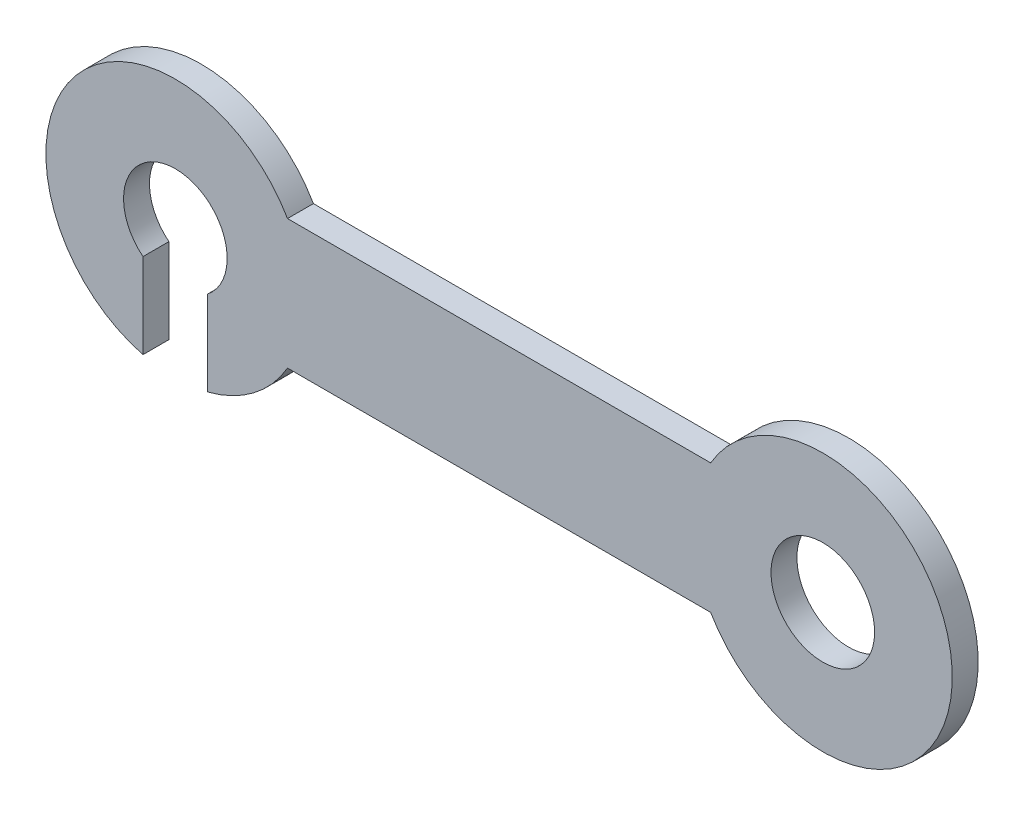
ISO-10303-21;
HEADER;
FILE_DESCRIPTION(('STEP AP214'),'2;1');
FILE_NAME('part.step','',(''),(''),'','','');
FILE_SCHEMA(('AUTOMOTIVE_DESIGN { 1 0 10303 214 1 1 1 1 }'));
ENDSEC;
DATA;
#1=APPLICATION_CONTEXT('core data for automotive mechanical design processes');
#2=APPLICATION_PROTOCOL_DEFINITION('international standard','automotive_design',2000,#1);
#3=PRODUCT_CONTEXT('',#1,'mechanical');
#4=PRODUCT('Part','Part','',(#3));
#5=PRODUCT_RELATED_PRODUCT_CATEGORY('part','',(#4));
#6=PRODUCT_DEFINITION_FORMATION('','',#4);
#7=PRODUCT_DEFINITION_CONTEXT('part definition',#1,'design');
#8=PRODUCT_DEFINITION('design','',#6,#7);
#9=PRODUCT_DEFINITION_SHAPE('','',#8);
#10=(LENGTH_UNIT() NAMED_UNIT(*) SI_UNIT(.MILLI.,.METRE.));
#11=(NAMED_UNIT(*) PLANE_ANGLE_UNIT() SI_UNIT($,.RADIAN.));
#12=(NAMED_UNIT(*) SI_UNIT($,.STERADIAN.) SOLID_ANGLE_UNIT());
#13=UNCERTAINTY_MEASURE_WITH_UNIT(LENGTH_MEASURE(1.E-05),#10,'distance_accuracy_value','');
#14=(GEOMETRIC_REPRESENTATION_CONTEXT(3) GLOBAL_UNCERTAINTY_ASSIGNED_CONTEXT((#13)) GLOBAL_UNIT_ASSIGNED_CONTEXT((#10,
#11,#12)) REPRESENTATION_CONTEXT('',''));
#15=CARTESIAN_POINT('',(0.,0.,0.));
#16=DIRECTION('',(0.,0.,1.));
#17=DIRECTION('',(1.,0.,0.));
#18=AXIS2_PLACEMENT_3D('',#15,#16,#17);
#19=CARTESIAN_POINT('',(0.,0.,4.));
#20=DIRECTION('',(0.,0.,-1.));
#21=DIRECTION('',(-1.,0.,0.));
#22=AXIS2_PLACEMENT_3D('',#19,#20,#21);
#23=CYLINDRICAL_SURFACE('',#22,20.);
#24=DIRECTION('',(0.,0.,-1.));
#25=VECTOR('',#24,1.);
#26=CARTESIAN_POINT('',(5.,-19.3649167310371,4.));
#27=LINE('',#26,#25);
#28=CARTESIAN_POINT('',(5.,-19.3649167310371,0.));
#29=VERTEX_POINT('',#28);
#30=CARTESIAN_POINT('',(5.,-19.3649167310371,4.));
#31=VERTEX_POINT('',#30);
#32=EDGE_CURVE('E98',#29,#31,#27,.F.);
#33=ORIENTED_EDGE('',*,*,#32,.F.);
#34=CARTESIAN_POINT('',(0.,0.,0.));
#35=DIRECTION('',(0.,0.,1.));
#36=DIRECTION('',(1.,0.,0.));
#37=AXIS2_PLACEMENT_3D('',#34,#35,#36);
#38=CIRCLE('',#37,20.);
#39=CARTESIAN_POINT('',(17.3205080756888,-10.,0.));
#40=VERTEX_POINT('',#39);
#41=EDGE_CURVE('E108',#29,#40,#38,.T.);
#42=ORIENTED_EDGE('',*,*,#41,.T.);
#43=DIRECTION('',(0.,0.,-1.));
#44=VECTOR('',#43,1.);
#45=CARTESIAN_POINT('',(17.3205080756888,-10.,4.));
#46=LINE('',#45,#44);
#47=CARTESIAN_POINT('',(17.3205080756888,-10.,4.));
#48=VERTEX_POINT('',#47);
#49=EDGE_CURVE('E123',#48,#40,#46,.T.);
#50=ORIENTED_EDGE('',*,*,#49,.F.);
#51=CARTESIAN_POINT('',(0.,0.,4.));
#52=DIRECTION('',(0.,0.,1.));
#53=DIRECTION('',(1.,0.,0.));
#54=AXIS2_PLACEMENT_3D('',#51,#52,#53);
#55=CIRCLE('',#54,20.);
#56=EDGE_CURVE('E110',#31,#48,#55,.T.);
#57=ORIENTED_EDGE('',*,*,#56,.F.);
#58=EDGE_LOOP('',(#33,#42,#50,#57));
#59=FACE_BOUND('',#58,.T.);
#60=ADVANCED_FACE('F34',(#59),#23,.T.);
#61=DIRECTION('',(0.,0.,-1.));
#62=VECTOR('',#61,1.);
#63=CARTESIAN_POINT('',(-5.,-19.3649167310371,4.));
#64=LINE('',#63,#62);
#65=CARTESIAN_POINT('',(-5.,-19.3649167310371,4.));
#66=VERTEX_POINT('',#65);
#67=CARTESIAN_POINT('',(-5.,-19.3649167310371,0.));
#68=VERTEX_POINT('',#67);
#69=EDGE_CURVE('E112',#66,#68,#64,.T.);
#70=ORIENTED_EDGE('',*,*,#69,.F.);
#71=CARTESIAN_POINT('',(17.3205080756888,10.,4.));
#72=VERTEX_POINT('',#71);
#73=EDGE_CURVE('E126',#72,#66,#55,.T.);
#74=ORIENTED_EDGE('',*,*,#73,.F.);
#75=DIRECTION('',(0.,0.,-1.));
#76=VECTOR('',#75,1.);
#77=CARTESIAN_POINT('',(17.3205080756888,10.,4.));
#78=LINE('',#77,#76);
#79=CARTESIAN_POINT('',(17.3205080756888,10.,0.));
#80=VERTEX_POINT('',#79);
#81=EDGE_CURVE('E119',#80,#72,#78,.F.);
#82=ORIENTED_EDGE('',*,*,#81,.F.);
#83=EDGE_CURVE('E118',#80,#68,#38,.T.);
#84=ORIENTED_EDGE('',*,*,#83,.T.);
#85=EDGE_LOOP('',(#70,#74,#82,#84));
#86=FACE_BOUND('',#85,.T.);
#87=ADVANCED_FACE('F170',(#86),#23,.T.);
#88=CARTESIAN_POINT('',(0.,0.,4.));
#89=DIRECTION('',(0.,0.,1.));
#90=DIRECTION('',(1.,0.,0.));
#91=AXIS2_PLACEMENT_3D('',#88,#89,#90);
#92=PLANE('',#91);
#93=CARTESIAN_POINT('',(100.,0.,4.));
#94=DIRECTION('',(0.,0.,1.));
#95=DIRECTION('',(1.,0.,0.));
#96=AXIS2_PLACEMENT_3D('',#93,#94,#95);
#97=CIRCLE('',#96,8.00000000000001);
#98=CARTESIAN_POINT('',(108.,0.,4.));
#99=VERTEX_POINT('',#98);
#100=EDGE_CURVE('E103',#99,#99,#97,.T.);
#101=ORIENTED_EDGE('',*,*,#100,.F.);
#102=EDGE_LOOP('',(#101));
#103=FACE_BOUND('',#102,.T.);
#104=CARTESIAN_POINT('',(0.,0.,4.));
#105=DIRECTION('',(0.,0.,1.));
#106=DIRECTION('',(1.,0.,0.));
#107=AXIS2_PLACEMENT_3D('',#104,#105,#106);
#108=CIRCLE('',#107,8.);
#109=CARTESIAN_POINT('',(5.,-6.2449979983984,4.));
#110=VERTEX_POINT('',#109);
#111=CARTESIAN_POINT('',(-5.,-6.2449979983984,4.));
#112=VERTEX_POINT('',#111);
#113=EDGE_CURVE('E157',#110,#112,#108,.T.);
#114=ORIENTED_EDGE('',*,*,#113,.F.);
#115=DIRECTION('',(0.,1.,0.));
#116=VECTOR('',#115,1.);
#117=CARTESIAN_POINT('',(5.,-23.9724249305707,4.));
#118=LINE('',#117,#116);
#119=EDGE_CURVE('E56',#31,#110,#118,.T.);
#120=ORIENTED_EDGE('',*,*,#119,.F.);
#121=ORIENTED_EDGE('',*,*,#56,.T.);
#122=DIRECTION('',(1.,0.,0.));
#123=VECTOR('',#122,1.);
#124=CARTESIAN_POINT('',(0.,-10.,4.));
#125=LINE('',#124,#123);
#126=CARTESIAN_POINT('',(82.6794919243112,-10.,4.));
#127=VERTEX_POINT('',#126);
#128=EDGE_CURVE('E137',#48,#127,#125,.T.);
#129=ORIENTED_EDGE('',*,*,#128,.T.);
#130=CARTESIAN_POINT('',(100.,0.,4.));
#131=DIRECTION('',(0.,0.,1.));
#132=DIRECTION('',(1.,0.,0.));
#133=AXIS2_PLACEMENT_3D('',#130,#131,#132);
#134=CIRCLE('',#133,20.);
#135=CARTESIAN_POINT('',(82.6794919243112,10.,4.));
#136=VERTEX_POINT('',#135);
#137=EDGE_CURVE('E149',#127,#136,#134,.T.);
#138=ORIENTED_EDGE('',*,*,#137,.T.);
#139=DIRECTION('',(-1.,0.,0.));
#140=VECTOR('',#139,1.);
#141=CARTESIAN_POINT('',(0.,10.,4.));
#142=LINE('',#141,#140);
#143=EDGE_CURVE('E146',#136,#72,#142,.T.);
#144=ORIENTED_EDGE('',*,*,#143,.T.);
#145=ORIENTED_EDGE('',*,*,#73,.T.);
#146=DIRECTION('',(0.,-1.,0.));
#147=VECTOR('',#146,1.);
#148=CARTESIAN_POINT('',(-5.,-23.9724249305707,4.));
#149=LINE('',#148,#147);
#150=EDGE_CURVE('E175',#112,#66,#149,.T.);
#151=ORIENTED_EDGE('',*,*,#150,.F.);
#152=EDGE_LOOP('',(#114,#120,#121,#129,#138,#144,#145,#151));
#153=FACE_BOUND('',#152,.T.);
#154=ADVANCED_FACE('F134',(#103,#153),#92,.T.);
#155=CARTESIAN_POINT('',(0.,0.,0.));
#156=DIRECTION('',(0.,0.,1.));
#157=DIRECTION('',(1.,0.,0.));
#158=AXIS2_PLACEMENT_3D('',#155,#156,#157);
#159=PLANE('',#158);
#160=CARTESIAN_POINT('',(100.,0.,0.));
#161=DIRECTION('',(0.,0.,1.));
#162=DIRECTION('',(1.,0.,0.));
#163=AXIS2_PLACEMENT_3D('',#160,#161,#162);
#164=CIRCLE('',#163,8.00000000000001);
#165=CARTESIAN_POINT('',(108.,0.,0.));
#166=VERTEX_POINT('',#165);
#167=EDGE_CURVE('E179',#166,#166,#164,.T.);
#168=ORIENTED_EDGE('',*,*,#167,.T.);
#169=EDGE_LOOP('',(#168));
#170=FACE_BOUND('',#169,.T.);
#171=DIRECTION('',(0.,1.,0.));
#172=VECTOR('',#171,1.);
#173=CARTESIAN_POINT('',(5.,-23.9724249305707,0.));
#174=LINE('',#173,#172);
#175=CARTESIAN_POINT('',(5.,-6.2449979983984,0.));
#176=VERTEX_POINT('',#175);
#177=EDGE_CURVE('E95',#29,#176,#174,.T.);
#178=ORIENTED_EDGE('',*,*,#177,.T.);
#179=CARTESIAN_POINT('',(0.,0.,0.));
#180=DIRECTION('',(0.,0.,1.));
#181=DIRECTION('',(1.,0.,0.));
#182=AXIS2_PLACEMENT_3D('',#179,#180,#181);
#183=CIRCLE('',#182,8.);
#184=CARTESIAN_POINT('',(-5.,-6.2449979983984,0.));
#185=VERTEX_POINT('',#184);
#186=EDGE_CURVE('E111',#176,#185,#183,.T.);
#187=ORIENTED_EDGE('',*,*,#186,.T.);
#188=DIRECTION('',(0.,-1.,0.));
#189=VECTOR('',#188,1.);
#190=CARTESIAN_POINT('',(-5.,-23.9724249305707,0.));
#191=LINE('',#190,#189);
#192=EDGE_CURVE('E48',#185,#68,#191,.T.);
#193=ORIENTED_EDGE('',*,*,#192,.T.);
#194=ORIENTED_EDGE('',*,*,#83,.F.);
#195=DIRECTION('',(-1.,0.,0.));
#196=VECTOR('',#195,1.);
#197=CARTESIAN_POINT('',(0.,10.,0.));
#198=LINE('',#197,#196);
#199=CARTESIAN_POINT('',(82.6794919243112,10.,0.));
#200=VERTEX_POINT('',#199);
#201=EDGE_CURVE('E156',#200,#80,#198,.T.);
#202=ORIENTED_EDGE('',*,*,#201,.F.);
#203=CARTESIAN_POINT('',(100.,0.,0.));
#204=DIRECTION('',(0.,0.,1.));
#205=DIRECTION('',(1.,0.,0.));
#206=AXIS2_PLACEMENT_3D('',#203,#204,#205);
#207=CIRCLE('',#206,20.);
#208=CARTESIAN_POINT('',(82.6794919243112,-10.,0.));
#209=VERTEX_POINT('',#208);
#210=EDGE_CURVE('E153',#209,#200,#207,.T.);
#211=ORIENTED_EDGE('',*,*,#210,.F.);
#212=DIRECTION('',(1.,0.,0.));
#213=VECTOR('',#212,1.);
#214=CARTESIAN_POINT('',(0.,-10.,0.));
#215=LINE('',#214,#213);
#216=EDGE_CURVE('E117',#40,#209,#215,.T.);
#217=ORIENTED_EDGE('',*,*,#216,.F.);
#218=ORIENTED_EDGE('',*,*,#41,.F.);
#219=EDGE_LOOP('',(#178,#187,#193,#194,#202,#211,#217,#218));
#220=FACE_BOUND('',#219,.T.);
#221=ADVANCED_FACE('F115',(#170,#220),#159,.F.);
#222=CARTESIAN_POINT('',(0.,0.,4.));
#223=DIRECTION('',(0.,0.,-1.));
#224=DIRECTION('',(-1.,0.,0.));
#225=AXIS2_PLACEMENT_3D('',#222,#223,#224);
#226=CYLINDRICAL_SURFACE('',#225,8.);
#227=ORIENTED_EDGE('',*,*,#186,.F.);
#228=DIRECTION('',(0.,0.,-1.));
#229=VECTOR('',#228,1.);
#230=CARTESIAN_POINT('',(5.,-6.2449979983984,4.));
#231=LINE('',#230,#229);
#232=EDGE_CURVE('E11',#176,#110,#231,.F.);
#233=ORIENTED_EDGE('',*,*,#232,.T.);
#234=ORIENTED_EDGE('',*,*,#113,.T.);
#235=DIRECTION('',(0.,0.,-1.));
#236=VECTOR('',#235,1.);
#237=CARTESIAN_POINT('',(-5.,-6.2449979983984,4.));
#238=LINE('',#237,#236);
#239=EDGE_CURVE('E41',#112,#185,#238,.T.);
#240=ORIENTED_EDGE('',*,*,#239,.T.);
#241=EDGE_LOOP('',(#227,#233,#234,#240));
#242=FACE_BOUND('',#241,.T.);
#243=ADVANCED_FACE('F194',(#242),#226,.F.);
#244=CARTESIAN_POINT('',(0.,10.,4.));
#245=DIRECTION('',(0.,-1.,0.));
#246=DIRECTION('',(1.,0.,0.));
#247=AXIS2_PLACEMENT_3D('',#244,#245,#246);
#248=PLANE('',#247);
#249=ORIENTED_EDGE('',*,*,#201,.T.);
#250=ORIENTED_EDGE('',*,*,#81,.T.);
#251=ORIENTED_EDGE('',*,*,#143,.F.);
#252=DIRECTION('',(0.,0.,-1.));
#253=VECTOR('',#252,1.);
#254=CARTESIAN_POINT('',(82.6794919243112,10.,4.));
#255=LINE('',#254,#253);
#256=EDGE_CURVE('E140',#136,#200,#255,.T.);
#257=ORIENTED_EDGE('',*,*,#256,.T.);
#258=EDGE_LOOP('',(#249,#250,#251,#257));
#259=FACE_BOUND('',#258,.T.);
#260=ADVANCED_FACE('F164',(#259),#248,.F.);
#261=CARTESIAN_POINT('',(0.,-10.,4.));
#262=DIRECTION('',(0.,1.,0.));
#263=DIRECTION('',(0.,0.,1.));
#264=AXIS2_PLACEMENT_3D('',#261,#262,#263);
#265=PLANE('',#264);
#266=ORIENTED_EDGE('',*,*,#128,.F.);
#267=ORIENTED_EDGE('',*,*,#49,.T.);
#268=ORIENTED_EDGE('',*,*,#216,.T.);
#269=DIRECTION('',(0.,0.,-1.));
#270=VECTOR('',#269,1.);
#271=CARTESIAN_POINT('',(82.6794919243112,-10.,4.));
#272=LINE('',#271,#270);
#273=EDGE_CURVE('E144',#127,#209,#272,.T.);
#274=ORIENTED_EDGE('',*,*,#273,.F.);
#275=EDGE_LOOP('',(#266,#267,#268,#274));
#276=FACE_BOUND('',#275,.T.);
#277=ADVANCED_FACE('F142',(#276),#265,.F.);
#278=CARTESIAN_POINT('',(100.,0.,4.));
#279=DIRECTION('',(0.,0.,-1.));
#280=DIRECTION('',(-1.,0.,0.));
#281=AXIS2_PLACEMENT_3D('',#278,#279,#280);
#282=CYLINDRICAL_SURFACE('',#281,20.);
#283=ORIENTED_EDGE('',*,*,#210,.T.);
#284=ORIENTED_EDGE('',*,*,#256,.F.);
#285=ORIENTED_EDGE('',*,*,#137,.F.);
#286=ORIENTED_EDGE('',*,*,#273,.T.);
#287=EDGE_LOOP('',(#283,#284,#285,#286));
#288=FACE_BOUND('',#287,.T.);
#289=ADVANCED_FACE('F166',(#288),#282,.T.);
#290=CARTESIAN_POINT('',(-5.,-23.9724249305707,4.));
#291=DIRECTION('',(1.,0.,0.));
#292=DIRECTION('',(0.,0.,-1.));
#293=AXIS2_PLACEMENT_3D('',#290,#291,#292);
#294=PLANE('',#293);
#295=ORIENTED_EDGE('',*,*,#69,.T.);
#296=ORIENTED_EDGE('',*,*,#192,.F.);
#297=ORIENTED_EDGE('',*,*,#239,.F.);
#298=ORIENTED_EDGE('',*,*,#150,.T.);
#299=EDGE_LOOP('',(#295,#296,#297,#298));
#300=FACE_BOUND('',#299,.T.);
#301=ADVANCED_FACE('F244',(#300),#294,.T.);
#302=CARTESIAN_POINT('',(5.,-23.9724249305707,4.));
#303=DIRECTION('',(-1.,0.,0.));
#304=DIRECTION('',(0.,0.,1.));
#305=AXIS2_PLACEMENT_3D('',#302,#303,#304);
#306=PLANE('',#305);
#307=ORIENTED_EDGE('',*,*,#32,.T.);
#308=ORIENTED_EDGE('',*,*,#119,.T.);
#309=ORIENTED_EDGE('',*,*,#232,.F.);
#310=ORIENTED_EDGE('',*,*,#177,.F.);
#311=EDGE_LOOP('',(#307,#308,#309,#310));
#312=FACE_BOUND('',#311,.T.);
#313=ADVANCED_FACE('F97',(#312),#306,.T.);
#314=CARTESIAN_POINT('',(100.,0.,4.));
#315=DIRECTION('',(0.,0.,-1.));
#316=DIRECTION('',(-1.,0.,0.));
#317=AXIS2_PLACEMENT_3D('',#314,#315,#316);
#318=CYLINDRICAL_SURFACE('',#317,8.00000000000001);
#319=ORIENTED_EDGE('',*,*,#100,.T.);
#320=EDGE_LOOP('',(#319));
#321=FACE_BOUND('',#320,.T.);
#322=ORIENTED_EDGE('',*,*,#167,.F.);
#323=EDGE_LOOP('',(#322));
#324=FACE_BOUND('',#323,.T.);
#325=ADVANCED_FACE('F185',(#321,#324),#318,.F.);
#326=CLOSED_SHELL('',(#60,#87,#154,#221,#243,#260,#277,#289,#301,#313,#325));
#327=MANIFOLD_SOLID_BREP('B2',#326);
#328=ADVANCED_BREP_SHAPE_REPRESENTATION('',(#18,#327),#14);
#329=SHAPE_DEFINITION_REPRESENTATION(#9,#328);
ENDSEC;
END-ISO-10303-21;
